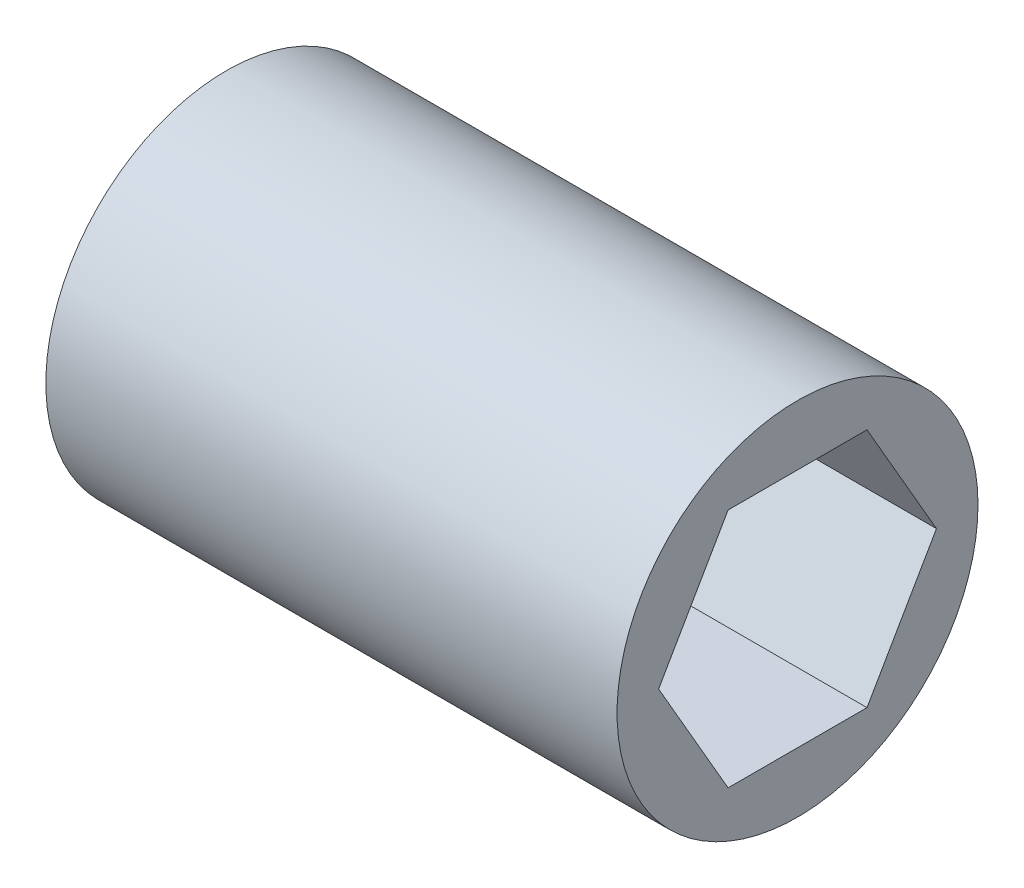
ISO-10303-21;
HEADER;
FILE_DESCRIPTION(('STEP AP214'),'2;1');
FILE_NAME('part.step','',(''),(''),'','','');
FILE_SCHEMA(('AUTOMOTIVE_DESIGN { 1 0 10303 214 1 1 1 1 }'));
ENDSEC;
DATA;
#1=APPLICATION_CONTEXT('core data for automotive mechanical design processes');
#2=APPLICATION_PROTOCOL_DEFINITION('international standard','automotive_design',2000,#1);
#3=PRODUCT_CONTEXT('',#1,'mechanical');
#4=PRODUCT('Part','Part','',(#3));
#5=PRODUCT_RELATED_PRODUCT_CATEGORY('part','',(#4));
#6=PRODUCT_DEFINITION_FORMATION('','',#4);
#7=PRODUCT_DEFINITION_CONTEXT('part definition',#1,'design');
#8=PRODUCT_DEFINITION('design','',#6,#7);
#9=PRODUCT_DEFINITION_SHAPE('','',#8);
#10=(LENGTH_UNIT() NAMED_UNIT(*) SI_UNIT(.MILLI.,.METRE.));
#11=(NAMED_UNIT(*) PLANE_ANGLE_UNIT() SI_UNIT($,.RADIAN.));
#12=(NAMED_UNIT(*) SI_UNIT($,.STERADIAN.) SOLID_ANGLE_UNIT());
#13=UNCERTAINTY_MEASURE_WITH_UNIT(LENGTH_MEASURE(1.E-05),#10,'distance_accuracy_value','');
#14=(GEOMETRIC_REPRESENTATION_CONTEXT(3) GLOBAL_UNCERTAINTY_ASSIGNED_CONTEXT((#13)) GLOBAL_UNIT_ASSIGNED_CONTEXT((#10,
#11,#12)) REPRESENTATION_CONTEXT('',''));
#15=CARTESIAN_POINT('',(0.,0.,0.));
#16=DIRECTION('',(0.,0.,1.));
#17=DIRECTION('',(1.,0.,0.));
#18=AXIS2_PLACEMENT_3D('',#15,#16,#17);
#19=CARTESIAN_POINT('',(15.075,0.,0.));
#20=DIRECTION('',(1.,0.,0.));
#21=DIRECTION('',(0.,0.,-1.));
#22=AXIS2_PLACEMENT_3D('',#19,#20,#21);
#23=PLANE('',#22);
#24=CARTESIAN_POINT('',(15.075,0.,0.));
#25=DIRECTION('',(1.,0.,0.));
#26=DIRECTION('',(0.,0.,-1.));
#27=AXIS2_PLACEMENT_3D('',#24,#25,#26);
#28=CIRCLE('',#27,9.52500000000001);
#29=CARTESIAN_POINT('',(15.075,0.,-9.52500000000001));
#30=VERTEX_POINT('',#29);
#31=EDGE_CURVE('E11',#30,#30,#28,.T.);
#32=ORIENTED_EDGE('',*,*,#31,.T.);
#33=EDGE_LOOP('',(#32));
#34=FACE_BOUND('',#33,.T.);
#35=DIRECTION('',(0.,0.866025403784441,0.499999999999996));
#36=VECTOR('',#35,1.);
#37=CARTESIAN_POINT('',(15.075,0.,-7.33234841870806));
#38=LINE('',#37,#36);
#39=CARTESIAN_POINT('',(15.075,0.,-7.33234841870806));
#40=VERTEX_POINT('',#39);
#41=CARTESIAN_POINT('',(15.075,6.35000000000008,-3.66617420935395));
#42=VERTEX_POINT('',#41);
#43=EDGE_CURVE('E96',#40,#42,#38,.T.);
#44=ORIENTED_EDGE('',*,*,#43,.F.);
#45=DIRECTION('',(0.,0.866025403784443,-0.499999999999992));
#46=VECTOR('',#45,1.);
#47=CARTESIAN_POINT('',(15.075,-6.34999999999999,-3.666174209354));
#48=LINE('',#47,#46);
#49=CARTESIAN_POINT('',(15.075,-6.34999999999999,-3.666174209354));
#50=VERTEX_POINT('',#49);
#51=EDGE_CURVE('E88',#50,#40,#48,.T.);
#52=ORIENTED_EDGE('',*,*,#51,.F.);
#53=DIRECTION('',(0.,0.,-1.));
#54=VECTOR('',#53,1.);
#55=CARTESIAN_POINT('',(15.075,-6.34999999999999,3.66617420935417));
#56=LINE('',#55,#54);
#57=CARTESIAN_POINT('',(15.075,-6.34999999999999,3.66617420935417));
#58=VERTEX_POINT('',#57);
#59=EDGE_CURVE('E116',#58,#50,#56,.T.);
#60=ORIENTED_EDGE('',*,*,#59,.F.);
#61=DIRECTION('',(0.,-0.866025403784438,-0.500000000000001));
#62=VECTOR('',#61,1.);
#63=CARTESIAN_POINT('',(15.075,0.,7.33234841870828));
#64=LINE('',#63,#62);
#65=CARTESIAN_POINT('',(15.075,0.,7.33234841870828));
#66=VERTEX_POINT('',#65);
#67=EDGE_CURVE('E114',#66,#58,#64,.T.);
#68=ORIENTED_EDGE('',*,*,#67,.F.);
#69=DIRECTION('',(0.,-0.86602540378444,0.499999999999998));
#70=VECTOR('',#69,1.);
#71=CARTESIAN_POINT('',(15.075,6.35000000000008,3.66617420935411));
#72=LINE('',#71,#70);
#73=CARTESIAN_POINT('',(15.075,6.35000000000008,3.66617420935411));
#74=VERTEX_POINT('',#73);
#75=EDGE_CURVE('E110',#74,#66,#72,.T.);
#76=ORIENTED_EDGE('',*,*,#75,.F.);
#77=DIRECTION('',(0.,0.,1.));
#78=VECTOR('',#77,1.);
#79=CARTESIAN_POINT('',(15.075,6.35000000000008,-3.66617420935395));
#80=LINE('',#79,#78);
#81=EDGE_CURVE('E108',#42,#74,#80,.T.);
#82=ORIENTED_EDGE('',*,*,#81,.F.);
#83=EDGE_LOOP('',(#44,#52,#60,#68,#76,#82));
#84=FACE_BOUND('',#83,.T.);
#85=ADVANCED_FACE('F35',(#34,#84),#23,.T.);
#86=CARTESIAN_POINT('',(-15.075,0.,0.));
#87=DIRECTION('',(1.,0.,0.));
#88=DIRECTION('',(0.,0.,-1.));
#89=AXIS2_PLACEMENT_3D('',#86,#87,#88);
#90=PLANE('',#89);
#91=CARTESIAN_POINT('',(-15.075,0.,0.));
#92=DIRECTION('',(1.,0.,0.));
#93=DIRECTION('',(0.,0.,-1.));
#94=AXIS2_PLACEMENT_3D('',#91,#92,#93);
#95=CIRCLE('',#94,9.52500000000001);
#96=CARTESIAN_POINT('',(-15.075,0.,-9.52500000000001));
#97=VERTEX_POINT('',#96);
#98=EDGE_CURVE('E39',#97,#97,#95,.T.);
#99=ORIENTED_EDGE('',*,*,#98,.F.);
#100=EDGE_LOOP('',(#99));
#101=FACE_BOUND('',#100,.T.);
#102=DIRECTION('',(0.,0.866025403784443,-0.499999999999992));
#103=VECTOR('',#102,1.);
#104=CARTESIAN_POINT('',(-15.075,-6.34999999999999,-3.666174209354));
#105=LINE('',#104,#103);
#106=CARTESIAN_POINT('',(-15.075,-6.34999999999999,-3.666174209354));
#107=VERTEX_POINT('',#106);
#108=CARTESIAN_POINT('',(-15.075,0.,-7.33234841870806));
#109=VERTEX_POINT('',#108);
#110=EDGE_CURVE('E58',#107,#109,#105,.T.);
#111=ORIENTED_EDGE('',*,*,#110,.T.);
#112=DIRECTION('',(0.,0.866025403784441,0.499999999999996));
#113=VECTOR('',#112,1.);
#114=CARTESIAN_POINT('',(-15.075,0.,-7.33234841870806));
#115=LINE('',#114,#113);
#116=CARTESIAN_POINT('',(-15.075,6.35000000000008,-3.66617420935395));
#117=VERTEX_POINT('',#116);
#118=EDGE_CURVE('E103',#109,#117,#115,.T.);
#119=ORIENTED_EDGE('',*,*,#118,.T.);
#120=DIRECTION('',(0.,0.,1.));
#121=VECTOR('',#120,1.);
#122=CARTESIAN_POINT('',(-15.075,6.35000000000008,-3.66617420935395));
#123=LINE('',#122,#121);
#124=CARTESIAN_POINT('',(-15.075,6.35000000000008,3.66617420935411));
#125=VERTEX_POINT('',#124);
#126=EDGE_CURVE('E120',#117,#125,#123,.T.);
#127=ORIENTED_EDGE('',*,*,#126,.T.);
#128=DIRECTION('',(0.,-0.86602540378444,0.499999999999998));
#129=VECTOR('',#128,1.);
#130=CARTESIAN_POINT('',(-15.075,6.35000000000008,3.66617420935411));
#131=LINE('',#130,#129);
#132=CARTESIAN_POINT('',(-15.075,0.,7.33234841870828));
#133=VERTEX_POINT('',#132);
#134=EDGE_CURVE('E123',#125,#133,#131,.T.);
#135=ORIENTED_EDGE('',*,*,#134,.T.);
#136=DIRECTION('',(0.,-0.866025403784438,-0.500000000000001));
#137=VECTOR('',#136,1.);
#138=CARTESIAN_POINT('',(-15.075,0.,7.33234841870828));
#139=LINE('',#138,#137);
#140=CARTESIAN_POINT('',(-15.075,-6.34999999999999,3.66617420935417));
#141=VERTEX_POINT('',#140);
#142=EDGE_CURVE('E126',#133,#141,#139,.T.);
#143=ORIENTED_EDGE('',*,*,#142,.T.);
#144=DIRECTION('',(0.,0.,-1.));
#145=VECTOR('',#144,1.);
#146=CARTESIAN_POINT('',(-15.075,-6.34999999999999,3.66617420935417));
#147=LINE('',#146,#145);
#148=EDGE_CURVE('E97',#141,#107,#147,.T.);
#149=ORIENTED_EDGE('',*,*,#148,.T.);
#150=EDGE_LOOP('',(#111,#119,#127,#135,#143,#149));
#151=FACE_BOUND('',#150,.T.);
#152=ADVANCED_FACE('F143',(#101,#151),#90,.F.);
#153=CARTESIAN_POINT('',(15.075,0.,0.));
#154=DIRECTION('',(-1.,0.,0.));
#155=DIRECTION('',(0.,0.,1.));
#156=AXIS2_PLACEMENT_3D('',#153,#154,#155);
#157=CYLINDRICAL_SURFACE('',#156,9.52500000000001);
#158=ORIENTED_EDGE('',*,*,#31,.F.);
#159=EDGE_LOOP('',(#158));
#160=FACE_BOUND('',#159,.T.);
#161=ORIENTED_EDGE('',*,*,#98,.T.);
#162=EDGE_LOOP('',(#161));
#163=FACE_BOUND('',#162,.T.);
#164=ADVANCED_FACE('F37',(#160,#163),#157,.T.);
#165=CARTESIAN_POINT('',(15.075,-6.34999999999999,-3.666174209354));
#166=DIRECTION('',(0.,0.499999999999992,0.866025403784443));
#167=DIRECTION('',(0.,-0.866025403784443,0.499999999999992));
#168=AXIS2_PLACEMENT_3D('',#165,#166,#167);
#169=PLANE('',#168);
#170=ORIENTED_EDGE('',*,*,#110,.F.);
#171=DIRECTION('',(-1.,0.,0.));
#172=VECTOR('',#171,1.);
#173=CARTESIAN_POINT('',(15.075,-6.34999999999999,-3.666174209354));
#174=LINE('',#173,#172);
#175=EDGE_CURVE('E92',#50,#107,#174,.T.);
#176=ORIENTED_EDGE('',*,*,#175,.F.);
#177=ORIENTED_EDGE('',*,*,#51,.T.);
#178=DIRECTION('',(-1.,0.,0.));
#179=VECTOR('',#178,1.);
#180=CARTESIAN_POINT('',(15.075,0.,-7.33234841870806));
#181=LINE('',#180,#179);
#182=EDGE_CURVE('E91',#40,#109,#181,.T.);
#183=ORIENTED_EDGE('',*,*,#182,.T.);
#184=EDGE_LOOP('',(#170,#176,#177,#183));
#185=FACE_BOUND('',#184,.T.);
#186=ADVANCED_FACE('F90',(#185),#169,.T.);
#187=CARTESIAN_POINT('',(15.075,0.,-7.33234841870806));
#188=DIRECTION('',(0.,-0.499999999999996,0.866025403784441));
#189=DIRECTION('',(0.,-0.866025403784441,-0.499999999999996));
#190=AXIS2_PLACEMENT_3D('',#187,#188,#189);
#191=PLANE('',#190);
#192=ORIENTED_EDGE('',*,*,#118,.F.);
#193=ORIENTED_EDGE('',*,*,#182,.F.);
#194=ORIENTED_EDGE('',*,*,#43,.T.);
#195=DIRECTION('',(-1.,0.,0.));
#196=VECTOR('',#195,1.);
#197=CARTESIAN_POINT('',(15.075,6.35000000000008,-3.66617420935395));
#198=LINE('',#197,#196);
#199=EDGE_CURVE('E104',#42,#117,#198,.T.);
#200=ORIENTED_EDGE('',*,*,#199,.T.);
#201=EDGE_LOOP('',(#192,#193,#194,#200));
#202=FACE_BOUND('',#201,.T.);
#203=ADVANCED_FACE('F100',(#202),#191,.T.);
#204=CARTESIAN_POINT('',(15.075,6.35000000000008,-3.66617420935395));
#205=DIRECTION('',(0.,-1.,0.));
#206=DIRECTION('',(0.,0.,-1.));
#207=AXIS2_PLACEMENT_3D('',#204,#205,#206);
#208=PLANE('',#207);
#209=ORIENTED_EDGE('',*,*,#126,.F.);
#210=ORIENTED_EDGE('',*,*,#199,.F.);
#211=ORIENTED_EDGE('',*,*,#81,.T.);
#212=DIRECTION('',(-1.,0.,0.));
#213=VECTOR('',#212,1.);
#214=CARTESIAN_POINT('',(15.075,6.35000000000008,3.66617420935411));
#215=LINE('',#214,#213);
#216=EDGE_CURVE('E135',#74,#125,#215,.T.);
#217=ORIENTED_EDGE('',*,*,#216,.T.);
#218=EDGE_LOOP('',(#209,#210,#211,#217));
#219=FACE_BOUND('',#218,.T.);
#220=ADVANCED_FACE('F139',(#219),#208,.T.);
#221=CARTESIAN_POINT('',(15.075,6.35000000000008,3.66617420935411));
#222=DIRECTION('',(0.,-0.499999999999998,-0.86602540378444));
#223=DIRECTION('',(0.,0.86602540378444,-0.499999999999998));
#224=AXIS2_PLACEMENT_3D('',#221,#222,#223);
#225=PLANE('',#224);
#226=ORIENTED_EDGE('',*,*,#134,.F.);
#227=ORIENTED_EDGE('',*,*,#216,.F.);
#228=ORIENTED_EDGE('',*,*,#75,.T.);
#229=DIRECTION('',(-1.,0.,0.));
#230=VECTOR('',#229,1.);
#231=CARTESIAN_POINT('',(15.075,0.,7.33234841870828));
#232=LINE('',#231,#230);
#233=EDGE_CURVE('E133',#66,#133,#232,.T.);
#234=ORIENTED_EDGE('',*,*,#233,.T.);
#235=EDGE_LOOP('',(#226,#227,#228,#234));
#236=FACE_BOUND('',#235,.T.);
#237=ADVANCED_FACE('F151',(#236),#225,.T.);
#238=CARTESIAN_POINT('',(15.075,0.,7.33234841870828));
#239=DIRECTION('',(0.,0.500000000000001,-0.866025403784438));
#240=DIRECTION('',(0.,0.866025403784438,0.500000000000001));
#241=AXIS2_PLACEMENT_3D('',#238,#239,#240);
#242=PLANE('',#241);
#243=ORIENTED_EDGE('',*,*,#142,.F.);
#244=ORIENTED_EDGE('',*,*,#233,.F.);
#245=ORIENTED_EDGE('',*,*,#67,.T.);
#246=DIRECTION('',(-1.,0.,0.));
#247=VECTOR('',#246,1.);
#248=CARTESIAN_POINT('',(15.075,-6.34999999999999,3.66617420935417));
#249=LINE('',#248,#247);
#250=EDGE_CURVE('E50',#58,#141,#249,.T.);
#251=ORIENTED_EDGE('',*,*,#250,.T.);
#252=EDGE_LOOP('',(#243,#244,#245,#251));
#253=FACE_BOUND('',#252,.T.);
#254=ADVANCED_FACE('F149',(#253),#242,.T.);
#255=CARTESIAN_POINT('',(15.075,-6.34999999999999,3.66617420935417));
#256=DIRECTION('',(0.,1.,0.));
#257=DIRECTION('',(0.,0.,1.));
#258=AXIS2_PLACEMENT_3D('',#255,#256,#257);
#259=PLANE('',#258);
#260=ORIENTED_EDGE('',*,*,#148,.F.);
#261=ORIENTED_EDGE('',*,*,#250,.F.);
#262=ORIENTED_EDGE('',*,*,#59,.T.);
#263=ORIENTED_EDGE('',*,*,#175,.T.);
#264=EDGE_LOOP('',(#260,#261,#262,#263));
#265=FACE_BOUND('',#264,.T.);
#266=ADVANCED_FACE('F145',(#265),#259,.T.);
#267=CLOSED_SHELL('',(#85,#152,#164,#186,#203,#220,#237,#254,#266));
#268=MANIFOLD_SOLID_BREP('B2',#267);
#269=ADVANCED_BREP_SHAPE_REPRESENTATION('',(#18,#268),#14);
#270=SHAPE_DEFINITION_REPRESENTATION(#9,#269);
ENDSEC;
END-ISO-10303-21;
